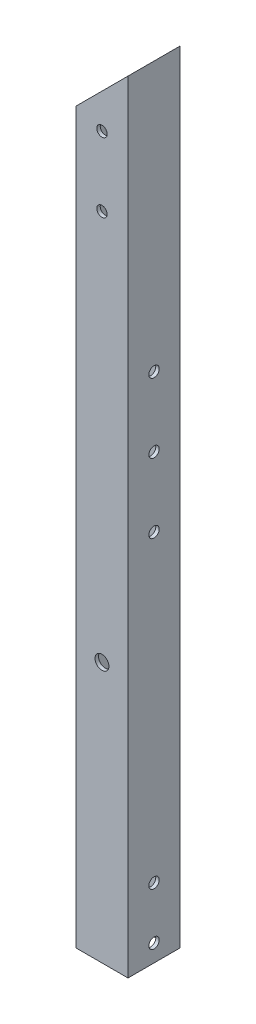
ISO-10303-21;
HEADER;
FILE_DESCRIPTION(('STEP AP214'),'2;1');
FILE_NAME('part.step','',(''),(''),'','','');
FILE_SCHEMA(('AUTOMOTIVE_DESIGN { 1 0 10303 214 1 1 1 1 }'));
ENDSEC;
DATA;
#1=APPLICATION_CONTEXT('core data for automotive mechanical design processes');
#2=APPLICATION_PROTOCOL_DEFINITION('international standard','automotive_design',2000,#1);
#3=PRODUCT_CONTEXT('',#1,'mechanical');
#4=PRODUCT('Part','Part','',(#3));
#5=PRODUCT_RELATED_PRODUCT_CATEGORY('part','',(#4));
#6=PRODUCT_DEFINITION_FORMATION('','',#4);
#7=PRODUCT_DEFINITION_CONTEXT('part definition',#1,'design');
#8=PRODUCT_DEFINITION('design','',#6,#7);
#9=PRODUCT_DEFINITION_SHAPE('','',#8);
#10=(LENGTH_UNIT() NAMED_UNIT(*) SI_UNIT(.MILLI.,.METRE.));
#11=(NAMED_UNIT(*) PLANE_ANGLE_UNIT() SI_UNIT($,.RADIAN.));
#12=(NAMED_UNIT(*) SI_UNIT($,.STERADIAN.) SOLID_ANGLE_UNIT());
#13=UNCERTAINTY_MEASURE_WITH_UNIT(LENGTH_MEASURE(1.E-05),#10,'distance_accuracy_value','');
#14=(GEOMETRIC_REPRESENTATION_CONTEXT(3) GLOBAL_UNCERTAINTY_ASSIGNED_CONTEXT((#13)) GLOBAL_UNIT_ASSIGNED_CONTEXT((#10,
#11,#12)) REPRESENTATION_CONTEXT('',''));
#15=CARTESIAN_POINT('',(0.,0.,0.));
#16=DIRECTION('',(0.,0.,1.));
#17=DIRECTION('',(1.,0.,0.));
#18=AXIS2_PLACEMENT_3D('',#15,#16,#17);
#19=CARTESIAN_POINT('',(0.,0.,0.));
#20=DIRECTION('',(0.,-1.,0.));
#21=DIRECTION('',(0.,0.,-1.));
#22=AXIS2_PLACEMENT_3D('',#19,#20,#21);
#23=PLANE('',#22);
#24=DIRECTION('',(0.,0.,-1.));
#25=VECTOR('',#24,1.);
#26=CARTESIAN_POINT('',(7.5,0.,7.5));
#27=LINE('',#26,#25);
#28=CARTESIAN_POINT('',(7.5,0.,7.5));
#29=VERTEX_POINT('',#28);
#30=CARTESIAN_POINT('',(7.5,0.,-7.5));
#31=VERTEX_POINT('',#30);
#32=EDGE_CURVE('E119',#29,#31,#27,.T.);
#33=ORIENTED_EDGE('',*,*,#32,.F.);
#34=DIRECTION('',(1.,0.,0.));
#35=VECTOR('',#34,1.);
#36=CARTESIAN_POINT('',(-7.5,0.,7.5));
#37=LINE('',#36,#35);
#38=CARTESIAN_POINT('',(-7.5,0.,7.5));
#39=VERTEX_POINT('',#38);
#40=EDGE_CURVE('E108',#39,#29,#37,.T.);
#41=ORIENTED_EDGE('',*,*,#40,.F.);
#42=DIRECTION('',(0.,0.,1.));
#43=VECTOR('',#42,1.);
#44=CARTESIAN_POINT('',(-7.5,0.,7.5));
#45=LINE('',#44,#43);
#46=CARTESIAN_POINT('',(-7.5,0.,-7.5));
#47=VERTEX_POINT('',#46);
#48=EDGE_CURVE('E228',#47,#39,#45,.T.);
#49=ORIENTED_EDGE('',*,*,#48,.F.);
#50=DIRECTION('',(-1.,0.,0.));
#51=VECTOR('',#50,1.);
#52=CARTESIAN_POINT('',(-7.5,0.,-7.5));
#53=LINE('',#52,#51);
#54=EDGE_CURVE('E226',#31,#47,#53,.T.);
#55=ORIENTED_EDGE('',*,*,#54,.F.);
#56=EDGE_LOOP('',(#33,#41,#49,#55));
#57=FACE_BOUND('',#56,.T.);
#58=DIRECTION('',(-1.,0.,0.));
#59=VECTOR('',#58,1.);
#60=CARTESIAN_POINT('',(-6.5,0.,-6.5));
#61=LINE('',#60,#59);
#62=CARTESIAN_POINT('',(6.5,0.,-6.5));
#63=VERTEX_POINT('',#62);
#64=CARTESIAN_POINT('',(-6.5,0.,-6.5));
#65=VERTEX_POINT('',#64);
#66=EDGE_CURVE('E214',#63,#65,#61,.T.);
#67=ORIENTED_EDGE('',*,*,#66,.T.);
#68=DIRECTION('',(0.,0.,1.));
#69=VECTOR('',#68,1.);
#70=CARTESIAN_POINT('',(-6.5,0.,6.5));
#71=LINE('',#70,#69);
#72=CARTESIAN_POINT('',(-6.5,0.,6.5));
#73=VERTEX_POINT('',#72);
#74=EDGE_CURVE('E205',#65,#73,#71,.T.);
#75=ORIENTED_EDGE('',*,*,#74,.T.);
#76=DIRECTION('',(1.,0.,0.));
#77=VECTOR('',#76,1.);
#78=CARTESIAN_POINT('',(-6.5,0.,6.5));
#79=LINE('',#78,#77);
#80=CARTESIAN_POINT('',(6.5,0.,6.5));
#81=VERTEX_POINT('',#80);
#82=EDGE_CURVE('E208',#73,#81,#79,.T.);
#83=ORIENTED_EDGE('',*,*,#82,.T.);
#84=DIRECTION('',(0.,0.,-1.));
#85=VECTOR('',#84,1.);
#86=CARTESIAN_POINT('',(6.5,0.,6.5));
#87=LINE('',#86,#85);
#88=EDGE_CURVE('E211',#81,#63,#87,.T.);
#89=ORIENTED_EDGE('',*,*,#88,.T.);
#90=EDGE_LOOP('',(#67,#75,#83,#89));
#91=FACE_BOUND('',#90,.T.);
#92=ADVANCED_FACE('F34',(#57,#91),#23,.T.);
#93=CARTESIAN_POINT('',(7.5,225.,7.5));
#94=DIRECTION('',(-1.,0.,0.));
#95=DIRECTION('',(0.,0.,1.));
#96=AXIS2_PLACEMENT_3D('',#93,#94,#95);
#97=PLANE('',#96);
#98=CARTESIAN_POINT('',(7.5,107.5,0.));
#99=DIRECTION('',(1.,0.,0.));
#100=DIRECTION('',(0.,0.,-1.));
#101=AXIS2_PLACEMENT_3D('',#98,#99,#100);
#102=CIRCLE('',#101,1.5);
#103=CARTESIAN_POINT('',(7.5,107.5,-1.50000000000001));
#104=VERTEX_POINT('',#103);
#105=EDGE_CURVE('E322',#104,#104,#102,.T.);
#106=ORIENTED_EDGE('',*,*,#105,.F.);
#107=EDGE_LOOP('',(#106));
#108=FACE_BOUND('',#107,.T.);
#109=CARTESIAN_POINT('',(7.5,147.5,0.));
#110=DIRECTION('',(1.,0.,0.));
#111=DIRECTION('',(0.,0.,-1.));
#112=AXIS2_PLACEMENT_3D('',#109,#110,#111);
#113=CIRCLE('',#112,1.5);
#114=CARTESIAN_POINT('',(7.5,147.5,-1.50000000000001));
#115=VERTEX_POINT('',#114);
#116=EDGE_CURVE('E326',#115,#115,#113,.T.);
#117=ORIENTED_EDGE('',*,*,#116,.F.);
#118=EDGE_LOOP('',(#117));
#119=FACE_BOUND('',#118,.T.);
#120=CARTESIAN_POINT('',(7.5,127.5,0.));
#121=DIRECTION('',(1.,0.,0.));
#122=DIRECTION('',(0.,0.,-1.));
#123=AXIS2_PLACEMENT_3D('',#120,#121,#122);
#124=CIRCLE('',#123,1.5);
#125=CARTESIAN_POINT('',(7.5,127.5,-1.50000000000001));
#126=VERTEX_POINT('',#125);
#127=EDGE_CURVE('E330',#126,#126,#124,.T.);
#128=ORIENTED_EDGE('',*,*,#127,.F.);
#129=EDGE_LOOP('',(#128));
#130=FACE_BOUND('',#129,.T.);
#131=CARTESIAN_POINT('',(7.5,20.,0.));
#132=DIRECTION('',(1.,0.,0.));
#133=DIRECTION('',(0.,0.,-1.));
#134=AXIS2_PLACEMENT_3D('',#131,#132,#133);
#135=CIRCLE('',#134,1.5);
#136=CARTESIAN_POINT('',(7.5,20.,-1.50000000000003));
#137=VERTEX_POINT('',#136);
#138=EDGE_CURVE('E334',#137,#137,#135,.T.);
#139=ORIENTED_EDGE('',*,*,#138,.F.);
#140=EDGE_LOOP('',(#139));
#141=FACE_BOUND('',#140,.T.);
#142=CARTESIAN_POINT('',(7.5,5.,0.));
#143=DIRECTION('',(1.,0.,0.));
#144=DIRECTION('',(0.,0.,-1.));
#145=AXIS2_PLACEMENT_3D('',#142,#143,#144);
#146=CIRCLE('',#145,1.5);
#147=CARTESIAN_POINT('',(7.5,5.,-1.50000000000003));
#148=VERTEX_POINT('',#147);
#149=EDGE_CURVE('E169',#148,#148,#146,.T.);
#150=ORIENTED_EDGE('',*,*,#149,.F.);
#151=EDGE_LOOP('',(#150));
#152=FACE_BOUND('',#151,.T.);
#153=ORIENTED_EDGE('',*,*,#32,.T.);
#154=DIRECTION('',(0.,-1.,0.));
#155=VECTOR('',#154,1.);
#156=CARTESIAN_POINT('',(7.5,225.,-7.5));
#157=LINE('',#156,#155);
#158=CARTESIAN_POINT('',(7.5,225.,-7.5));
#159=VERTEX_POINT('',#158);
#160=EDGE_CURVE('E43',#159,#31,#157,.T.);
#161=ORIENTED_EDGE('',*,*,#160,.F.);
#162=DIRECTION('',(0.,0.,-1.));
#163=VECTOR('',#162,1.);
#164=CARTESIAN_POINT('',(7.5,225.,7.5));
#165=LINE('',#164,#163);
#166=CARTESIAN_POINT('',(7.5,225.,7.5));
#167=VERTEX_POINT('',#166);
#168=EDGE_CURVE('E98',#167,#159,#165,.T.);
#169=ORIENTED_EDGE('',*,*,#168,.F.);
#170=DIRECTION('',(0.,-1.,0.));
#171=VECTOR('',#170,1.);
#172=CARTESIAN_POINT('',(7.5,225.,7.5));
#173=LINE('',#172,#171);
#174=EDGE_CURVE('E107',#167,#29,#173,.T.);
#175=ORIENTED_EDGE('',*,*,#174,.T.);
#176=EDGE_LOOP('',(#153,#161,#169,#175));
#177=FACE_BOUND('',#176,.T.);
#178=ADVANCED_FACE('F36',(#108,#119,#130,#141,#152,#177),#97,.F.);
#179=CARTESIAN_POINT('',(-7.5,225.,-7.5));
#180=DIRECTION('',(0.,0.,1.));
#181=DIRECTION('',(1.,0.,0.));
#182=AXIS2_PLACEMENT_3D('',#179,#180,#181);
#183=PLANE('',#182);
#184=CARTESIAN_POINT('',(0.,75.,-7.5));
#185=DIRECTION('',(0.,0.,1.));
#186=DIRECTION('',(1.,0.,0.));
#187=AXIS2_PLACEMENT_3D('',#184,#185,#186);
#188=CIRCLE('',#187,2.);
#189=CARTESIAN_POINT('',(2.,75.,-7.5));
#190=VERTEX_POINT('',#189);
#191=EDGE_CURVE('E178',#190,#190,#188,.T.);
#192=ORIENTED_EDGE('',*,*,#191,.T.);
#193=EDGE_LOOP('',(#192));
#194=FACE_BOUND('',#193,.T.);
#195=CARTESIAN_POINT('',(0.,187.5,-7.5));
#196=DIRECTION('',(0.,0.,1.));
#197=DIRECTION('',(1.,0.,0.));
#198=AXIS2_PLACEMENT_3D('',#195,#196,#197);
#199=CIRCLE('',#198,1.5);
#200=CARTESIAN_POINT('',(1.5,187.5,-7.5));
#201=VERTEX_POINT('',#200);
#202=EDGE_CURVE('E133',#201,#201,#199,.T.);
#203=ORIENTED_EDGE('',*,*,#202,.T.);
#204=EDGE_LOOP('',(#203));
#205=FACE_BOUND('',#204,.T.);
#206=CARTESIAN_POINT('',(0.,207.5,-7.5));
#207=DIRECTION('',(0.,0.,1.));
#208=DIRECTION('',(1.,0.,0.));
#209=AXIS2_PLACEMENT_3D('',#206,#207,#208);
#210=CIRCLE('',#209,1.5);
#211=CARTESIAN_POINT('',(1.5,207.5,-7.5));
#212=VERTEX_POINT('',#211);
#213=EDGE_CURVE('E129',#212,#212,#210,.T.);
#214=ORIENTED_EDGE('',*,*,#213,.T.);
#215=EDGE_LOOP('',(#214));
#216=FACE_BOUND('',#215,.T.);
#217=DIRECTION('',(0.,-1.,0.));
#218=VECTOR('',#217,1.);
#219=CARTESIAN_POINT('',(-7.5,225.,-7.5));
#220=LINE('',#219,#218);
#221=CARTESIAN_POINT('',(-7.5,210.,-7.5));
#222=VERTEX_POINT('',#221);
#223=EDGE_CURVE('E116',#222,#47,#220,.T.);
#224=ORIENTED_EDGE('',*,*,#223,.F.);
#225=DIRECTION('',(0.707106781186548,0.707106781186547,0.));
#226=VECTOR('',#225,1.);
#227=CARTESIAN_POINT('',(-7.5,210.,-7.5));
#228=LINE('',#227,#226);
#229=EDGE_CURVE('E101',#222,#159,#228,.T.);
#230=ORIENTED_EDGE('',*,*,#229,.T.);
#231=ORIENTED_EDGE('',*,*,#160,.T.);
#232=ORIENTED_EDGE('',*,*,#54,.T.);
#233=EDGE_LOOP('',(#224,#230,#231,#232));
#234=FACE_BOUND('',#233,.T.);
#235=ADVANCED_FACE('F113',(#194,#205,#216,#234),#183,.F.);
#236=CARTESIAN_POINT('',(-7.5,225.,7.5));
#237=DIRECTION('',(1.,0.,0.));
#238=DIRECTION('',(0.,0.,-1.));
#239=AXIS2_PLACEMENT_3D('',#236,#237,#238);
#240=PLANE('',#239);
#241=CARTESIAN_POINT('',(-7.5,107.5,0.));
#242=DIRECTION('',(1.,0.,0.));
#243=DIRECTION('',(0.,0.,-1.));
#244=AXIS2_PLACEMENT_3D('',#241,#242,#243);
#245=CIRCLE('',#244,1.5);
#246=CARTESIAN_POINT('',(-7.5,107.5,-1.50000000000001));
#247=VERTEX_POINT('',#246);
#248=EDGE_CURVE('E510',#247,#247,#245,.T.);
#249=ORIENTED_EDGE('',*,*,#248,.T.);
#250=EDGE_LOOP('',(#249));
#251=FACE_BOUND('',#250,.T.);
#252=CARTESIAN_POINT('',(-7.5,147.5,0.));
#253=DIRECTION('',(1.,0.,0.));
#254=DIRECTION('',(0.,0.,-1.));
#255=AXIS2_PLACEMENT_3D('',#252,#253,#254);
#256=CIRCLE('',#255,1.5);
#257=CARTESIAN_POINT('',(-7.5,147.5,-1.50000000000001));
#258=VERTEX_POINT('',#257);
#259=EDGE_CURVE('E512',#258,#258,#256,.T.);
#260=ORIENTED_EDGE('',*,*,#259,.T.);
#261=EDGE_LOOP('',(#260));
#262=FACE_BOUND('',#261,.T.);
#263=CARTESIAN_POINT('',(-7.5,127.5,0.));
#264=DIRECTION('',(1.,0.,0.));
#265=DIRECTION('',(0.,0.,-1.));
#266=AXIS2_PLACEMENT_3D('',#263,#264,#265);
#267=CIRCLE('',#266,1.5);
#268=CARTESIAN_POINT('',(-7.5,127.5,-1.50000000000001));
#269=VERTEX_POINT('',#268);
#270=EDGE_CURVE('E520',#269,#269,#267,.T.);
#271=ORIENTED_EDGE('',*,*,#270,.T.);
#272=EDGE_LOOP('',(#271));
#273=FACE_BOUND('',#272,.T.);
#274=CARTESIAN_POINT('',(-7.5,20.,0.));
#275=DIRECTION('',(1.,0.,0.));
#276=DIRECTION('',(0.,0.,-1.));
#277=AXIS2_PLACEMENT_3D('',#274,#275,#276);
#278=CIRCLE('',#277,1.5);
#279=CARTESIAN_POINT('',(-7.5,20.,-1.50000000000003));
#280=VERTEX_POINT('',#279);
#281=EDGE_CURVE('E148',#280,#280,#278,.T.);
#282=ORIENTED_EDGE('',*,*,#281,.T.);
#283=EDGE_LOOP('',(#282));
#284=FACE_BOUND('',#283,.T.);
#285=CARTESIAN_POINT('',(-7.5,5.,0.));
#286=DIRECTION('',(1.,0.,0.));
#287=DIRECTION('',(0.,0.,-1.));
#288=AXIS2_PLACEMENT_3D('',#285,#286,#287);
#289=CIRCLE('',#288,1.5);
#290=CARTESIAN_POINT('',(-7.5,5.,-1.50000000000003));
#291=VERTEX_POINT('',#290);
#292=EDGE_CURVE('E143',#291,#291,#289,.T.);
#293=ORIENTED_EDGE('',*,*,#292,.T.);
#294=EDGE_LOOP('',(#293));
#295=FACE_BOUND('',#294,.T.);
#296=DIRECTION('',(0.,-1.,0.));
#297=VECTOR('',#296,1.);
#298=CARTESIAN_POINT('',(-7.5,225.,7.5));
#299=LINE('',#298,#297);
#300=CARTESIAN_POINT('',(-7.5,210.,7.5));
#301=VERTEX_POINT('',#300);
#302=EDGE_CURVE('E121',#301,#39,#299,.T.);
#303=ORIENTED_EDGE('',*,*,#302,.F.);
#304=DIRECTION('',(0.,0.,1.));
#305=VECTOR('',#304,1.);
#306=CARTESIAN_POINT('',(-7.5,210.,-7.5));
#307=LINE('',#306,#305);
#308=EDGE_CURVE('E51',#222,#301,#307,.T.);
#309=ORIENTED_EDGE('',*,*,#308,.F.);
#310=ORIENTED_EDGE('',*,*,#223,.T.);
#311=ORIENTED_EDGE('',*,*,#48,.T.);
#312=EDGE_LOOP('',(#303,#309,#310,#311));
#313=FACE_BOUND('',#312,.T.);
#314=ADVANCED_FACE('F238',(#251,#262,#273,#284,#295,#313),#240,.F.);
#315=CARTESIAN_POINT('',(-7.5,225.,7.5));
#316=DIRECTION('',(0.,0.,-1.));
#317=DIRECTION('',(-1.,0.,0.));
#318=AXIS2_PLACEMENT_3D('',#315,#316,#317);
#319=PLANE('',#318);
#320=CARTESIAN_POINT('',(0.,75.,7.5));
#321=DIRECTION('',(0.,0.,1.));
#322=DIRECTION('',(1.,0.,0.));
#323=AXIS2_PLACEMENT_3D('',#320,#321,#322);
#324=CIRCLE('',#323,2.);
#325=CARTESIAN_POINT('',(2.,75.,7.5));
#326=VERTEX_POINT('',#325);
#327=EDGE_CURVE('E175',#326,#326,#324,.T.);
#328=ORIENTED_EDGE('',*,*,#327,.F.);
#329=EDGE_LOOP('',(#328));
#330=FACE_BOUND('',#329,.T.);
#331=CARTESIAN_POINT('',(0.,187.5,7.5));
#332=DIRECTION('',(0.,0.,1.));
#333=DIRECTION('',(1.,0.,0.));
#334=AXIS2_PLACEMENT_3D('',#331,#332,#333);
#335=CIRCLE('',#334,1.5);
#336=CARTESIAN_POINT('',(1.5,187.5,7.5));
#337=VERTEX_POINT('',#336);
#338=EDGE_CURVE('E180',#337,#337,#335,.T.);
#339=ORIENTED_EDGE('',*,*,#338,.F.);
#340=EDGE_LOOP('',(#339));
#341=FACE_BOUND('',#340,.T.);
#342=CARTESIAN_POINT('',(0.,207.5,7.5));
#343=DIRECTION('',(0.,0.,1.));
#344=DIRECTION('',(1.,0.,0.));
#345=AXIS2_PLACEMENT_3D('',#342,#343,#344);
#346=CIRCLE('',#345,1.5);
#347=CARTESIAN_POINT('',(1.5,207.5,7.5));
#348=VERTEX_POINT('',#347);
#349=EDGE_CURVE('E198',#348,#348,#346,.T.);
#350=ORIENTED_EDGE('',*,*,#349,.F.);
#351=EDGE_LOOP('',(#350));
#352=FACE_BOUND('',#351,.T.);
#353=ORIENTED_EDGE('',*,*,#174,.F.);
#354=DIRECTION('',(0.707106781186548,0.707106781186547,0.));
#355=VECTOR('',#354,1.);
#356=CARTESIAN_POINT('',(-7.5,210.,7.5));
#357=LINE('',#356,#355);
#358=EDGE_CURVE('E102',#301,#167,#357,.T.);
#359=ORIENTED_EDGE('',*,*,#358,.F.);
#360=ORIENTED_EDGE('',*,*,#302,.T.);
#361=ORIENTED_EDGE('',*,*,#40,.T.);
#362=EDGE_LOOP('',(#353,#359,#360,#361));
#363=FACE_BOUND('',#362,.T.);
#364=ADVANCED_FACE('F234',(#330,#341,#352,#363),#319,.F.);
#365=CARTESIAN_POINT('',(-6.5,225.,6.5));
#366=DIRECTION('',(1.,0.,0.));
#367=DIRECTION('',(0.,0.,-1.));
#368=AXIS2_PLACEMENT_3D('',#365,#366,#367);
#369=PLANE('',#368);
#370=CARTESIAN_POINT('',(-6.5,107.5,0.));
#371=DIRECTION('',(1.,0.,0.));
#372=DIRECTION('',(0.,0.,-1.));
#373=AXIS2_PLACEMENT_3D('',#370,#371,#372);
#374=CIRCLE('',#373,1.5);
#375=CARTESIAN_POINT('',(-6.5,107.5,-1.50000000000001));
#376=VERTEX_POINT('',#375);
#377=EDGE_CURVE('E166',#376,#376,#374,.T.);
#378=ORIENTED_EDGE('',*,*,#377,.F.);
#379=EDGE_LOOP('',(#378));
#380=FACE_BOUND('',#379,.T.);
#381=CARTESIAN_POINT('',(-6.5,147.5,0.));
#382=DIRECTION('',(1.,0.,0.));
#383=DIRECTION('',(0.,0.,-1.));
#384=AXIS2_PLACEMENT_3D('',#381,#382,#383);
#385=CIRCLE('',#384,1.5);
#386=CARTESIAN_POINT('',(-6.5,147.5,-1.50000000000001));
#387=VERTEX_POINT('',#386);
#388=EDGE_CURVE('E154',#387,#387,#385,.T.);
#389=ORIENTED_EDGE('',*,*,#388,.F.);
#390=EDGE_LOOP('',(#389));
#391=FACE_BOUND('',#390,.T.);
#392=CARTESIAN_POINT('',(-6.5,127.5,0.));
#393=DIRECTION('',(1.,0.,0.));
#394=DIRECTION('',(0.,0.,-1.));
#395=AXIS2_PLACEMENT_3D('',#392,#393,#394);
#396=CIRCLE('',#395,1.5);
#397=CARTESIAN_POINT('',(-6.5,127.5,-1.50000000000001));
#398=VERTEX_POINT('',#397);
#399=EDGE_CURVE('E151',#398,#398,#396,.T.);
#400=ORIENTED_EDGE('',*,*,#399,.F.);
#401=EDGE_LOOP('',(#400));
#402=FACE_BOUND('',#401,.T.);
#403=CARTESIAN_POINT('',(-6.5,20.,0.));
#404=DIRECTION('',(1.,0.,0.));
#405=DIRECTION('',(0.,0.,-1.));
#406=AXIS2_PLACEMENT_3D('',#403,#404,#405);
#407=CIRCLE('',#406,1.5);
#408=CARTESIAN_POINT('',(-6.5,20.,-1.50000000000003));
#409=VERTEX_POINT('',#408);
#410=EDGE_CURVE('E147',#409,#409,#407,.T.);
#411=ORIENTED_EDGE('',*,*,#410,.F.);
#412=EDGE_LOOP('',(#411));
#413=FACE_BOUND('',#412,.T.);
#414=CARTESIAN_POINT('',(-6.5,5.,0.));
#415=DIRECTION('',(1.,0.,0.));
#416=DIRECTION('',(0.,0.,-1.));
#417=AXIS2_PLACEMENT_3D('',#414,#415,#416);
#418=CIRCLE('',#417,1.5);
#419=CARTESIAN_POINT('',(-6.5,5.,-1.50000000000003));
#420=VERTEX_POINT('',#419);
#421=EDGE_CURVE('E142',#420,#420,#418,.T.);
#422=ORIENTED_EDGE('',*,*,#421,.F.);
#423=EDGE_LOOP('',(#422));
#424=FACE_BOUND('',#423,.T.);
#425=DIRECTION('',(0.,0.,-1.));
#426=VECTOR('',#425,1.);
#427=CARTESIAN_POINT('',(-6.5,211.,6.5));
#428=LINE('',#427,#426);
#429=CARTESIAN_POINT('',(-6.5,211.,6.5));
#430=VERTEX_POINT('',#429);
#431=CARTESIAN_POINT('',(-6.5,211.,-6.5));
#432=VERTEX_POINT('',#431);
#433=EDGE_CURVE('E58',#430,#432,#428,.T.);
#434=ORIENTED_EDGE('',*,*,#433,.F.);
#435=DIRECTION('',(0.,-1.,0.));
#436=VECTOR('',#435,1.);
#437=CARTESIAN_POINT('',(-6.5,225.,6.5));
#438=LINE('',#437,#436);
#439=EDGE_CURVE('E223',#430,#73,#438,.T.);
#440=ORIENTED_EDGE('',*,*,#439,.T.);
#441=ORIENTED_EDGE('',*,*,#74,.F.);
#442=DIRECTION('',(0.,-1.,0.));
#443=VECTOR('',#442,1.);
#444=CARTESIAN_POINT('',(-6.5,225.,-6.5));
#445=LINE('',#444,#443);
#446=EDGE_CURVE('E217',#432,#65,#445,.T.);
#447=ORIENTED_EDGE('',*,*,#446,.F.);
#448=EDGE_LOOP('',(#434,#440,#441,#447));
#449=FACE_BOUND('',#448,.T.);
#450=ADVANCED_FACE('F252',(#380,#391,#402,#413,#424,#449),#369,.T.);
#451=CARTESIAN_POINT('',(-6.5,225.,6.5));
#452=DIRECTION('',(0.,0.,-1.));
#453=DIRECTION('',(-1.,0.,0.));
#454=AXIS2_PLACEMENT_3D('',#451,#452,#453);
#455=PLANE('',#454);
#456=CARTESIAN_POINT('',(0.,75.,6.5));
#457=DIRECTION('',(0.,0.,-1.));
#458=DIRECTION('',(-1.,0.,0.));
#459=AXIS2_PLACEMENT_3D('',#456,#457,#458);
#460=CIRCLE('',#459,2.);
#461=CARTESIAN_POINT('',(-2.,75.,6.5));
#462=VERTEX_POINT('',#461);
#463=EDGE_CURVE('E138',#462,#462,#460,.T.);
#464=ORIENTED_EDGE('',*,*,#463,.F.);
#465=EDGE_LOOP('',(#464));
#466=FACE_BOUND('',#465,.T.);
#467=DIRECTION('',(-0.707106781186548,-0.707106781186547,0.));
#468=VECTOR('',#467,1.);
#469=CARTESIAN_POINT('',(0.499999999999994,218.,6.5));
#470=LINE('',#469,#468);
#471=CARTESIAN_POINT('',(6.5,224.,6.5));
#472=VERTEX_POINT('',#471);
#473=EDGE_CURVE('E193',#472,#430,#470,.T.);
#474=ORIENTED_EDGE('',*,*,#473,.F.);
#475=DIRECTION('',(0.,-1.,0.));
#476=VECTOR('',#475,1.);
#477=CARTESIAN_POINT('',(6.5,225.,6.5));
#478=LINE('',#477,#476);
#479=EDGE_CURVE('E221',#472,#81,#478,.T.);
#480=ORIENTED_EDGE('',*,*,#479,.T.);
#481=ORIENTED_EDGE('',*,*,#82,.F.);
#482=ORIENTED_EDGE('',*,*,#439,.F.);
#483=EDGE_LOOP('',(#474,#480,#481,#482));
#484=FACE_BOUND('',#483,.T.);
#485=CARTESIAN_POINT('',(0.,187.5,6.5));
#486=DIRECTION('',(0.,0.,-1.));
#487=DIRECTION('',(-1.,0.,0.));
#488=AXIS2_PLACEMENT_3D('',#485,#486,#487);
#489=CIRCLE('',#488,1.5);
#490=CARTESIAN_POINT('',(-1.5,187.5,6.5));
#491=VERTEX_POINT('',#490);
#492=EDGE_CURVE('E132',#491,#491,#489,.T.);
#493=ORIENTED_EDGE('',*,*,#492,.F.);
#494=EDGE_LOOP('',(#493));
#495=FACE_BOUND('',#494,.T.);
#496=CARTESIAN_POINT('',(0.,207.5,6.5));
#497=DIRECTION('',(0.,0.,-1.));
#498=DIRECTION('',(-1.,0.,0.));
#499=AXIS2_PLACEMENT_3D('',#496,#497,#498);
#500=CIRCLE('',#499,1.5);
#501=CARTESIAN_POINT('',(-1.5,207.5,6.5));
#502=VERTEX_POINT('',#501);
#503=EDGE_CURVE('E128',#502,#502,#500,.T.);
#504=ORIENTED_EDGE('',*,*,#503,.F.);
#505=EDGE_LOOP('',(#504));
#506=FACE_BOUND('',#505,.T.);
#507=ADVANCED_FACE('F257',(#466,#484,#495,#506),#455,.T.);
#508=CARTESIAN_POINT('',(6.5,225.,6.5));
#509=DIRECTION('',(-1.,0.,0.));
#510=DIRECTION('',(0.,0.,1.));
#511=AXIS2_PLACEMENT_3D('',#508,#509,#510);
#512=PLANE('',#511);
#513=CARTESIAN_POINT('',(6.5,107.5,0.));
#514=DIRECTION('',(-1.,0.,0.));
#515=DIRECTION('',(0.,0.,1.));
#516=AXIS2_PLACEMENT_3D('',#513,#514,#515);
#517=CIRCLE('',#516,1.5);
#518=CARTESIAN_POINT('',(6.5,107.5,1.49999999999999));
#519=VERTEX_POINT('',#518);
#520=EDGE_CURVE('E38',#519,#519,#517,.T.);
#521=ORIENTED_EDGE('',*,*,#520,.F.);
#522=EDGE_LOOP('',(#521));
#523=FACE_BOUND('',#522,.T.);
#524=CARTESIAN_POINT('',(6.5,147.5,0.));
#525=DIRECTION('',(-1.,0.,0.));
#526=DIRECTION('',(0.,0.,1.));
#527=AXIS2_PLACEMENT_3D('',#524,#525,#526);
#528=CIRCLE('',#527,1.5);
#529=CARTESIAN_POINT('',(6.5,147.5,1.49999999999999));
#530=VERTEX_POINT('',#529);
#531=EDGE_CURVE('E152',#530,#530,#528,.T.);
#532=ORIENTED_EDGE('',*,*,#531,.F.);
#533=EDGE_LOOP('',(#532));
#534=FACE_BOUND('',#533,.T.);
#535=CARTESIAN_POINT('',(6.5,127.5,0.));
#536=DIRECTION('',(-1.,0.,0.));
#537=DIRECTION('',(0.,0.,1.));
#538=AXIS2_PLACEMENT_3D('',#535,#536,#537);
#539=CIRCLE('',#538,1.5);
#540=CARTESIAN_POINT('',(6.5,127.5,1.49999999999999));
#541=VERTEX_POINT('',#540);
#542=EDGE_CURVE('E149',#541,#541,#539,.T.);
#543=ORIENTED_EDGE('',*,*,#542,.F.);
#544=EDGE_LOOP('',(#543));
#545=FACE_BOUND('',#544,.T.);
#546=CARTESIAN_POINT('',(6.5,20.,0.));
#547=DIRECTION('',(-1.,0.,0.));
#548=DIRECTION('',(0.,0.,1.));
#549=AXIS2_PLACEMENT_3D('',#546,#547,#548);
#550=CIRCLE('',#549,1.5);
#551=CARTESIAN_POINT('',(6.5,20.,1.49999999999998));
#552=VERTEX_POINT('',#551);
#553=EDGE_CURVE('E144',#552,#552,#550,.T.);
#554=ORIENTED_EDGE('',*,*,#553,.F.);
#555=EDGE_LOOP('',(#554));
#556=FACE_BOUND('',#555,.T.);
#557=CARTESIAN_POINT('',(6.5,5.,0.));
#558=DIRECTION('',(-1.,0.,0.));
#559=DIRECTION('',(0.,0.,1.));
#560=AXIS2_PLACEMENT_3D('',#557,#558,#559);
#561=CIRCLE('',#560,1.5);
#562=CARTESIAN_POINT('',(6.5,5.,1.49999999999997));
#563=VERTEX_POINT('',#562);
#564=EDGE_CURVE('E139',#563,#563,#561,.T.);
#565=ORIENTED_EDGE('',*,*,#564,.F.);
#566=EDGE_LOOP('',(#565));
#567=FACE_BOUND('',#566,.T.);
#568=DIRECTION('',(0.,0.,1.));
#569=VECTOR('',#568,1.);
#570=CARTESIAN_POINT('',(6.5,224.,6.5));
#571=LINE('',#570,#569);
#572=CARTESIAN_POINT('',(6.5,224.,-6.5));
#573=VERTEX_POINT('',#572);
#574=EDGE_CURVE('E191',#573,#472,#571,.T.);
#575=ORIENTED_EDGE('',*,*,#574,.F.);
#576=DIRECTION('',(0.,-1.,0.));
#577=VECTOR('',#576,1.);
#578=CARTESIAN_POINT('',(6.5,225.,-6.5));
#579=LINE('',#578,#577);
#580=EDGE_CURVE('E219',#573,#63,#579,.T.);
#581=ORIENTED_EDGE('',*,*,#580,.T.);
#582=ORIENTED_EDGE('',*,*,#88,.F.);
#583=ORIENTED_EDGE('',*,*,#479,.F.);
#584=EDGE_LOOP('',(#575,#581,#582,#583));
#585=FACE_BOUND('',#584,.T.);
#586=ADVANCED_FACE('F262',(#523,#534,#545,#556,#567,#585),#512,.T.);
#587=CARTESIAN_POINT('',(-6.5,225.,-6.5));
#588=DIRECTION('',(0.,0.,1.));
#589=DIRECTION('',(1.,0.,0.));
#590=AXIS2_PLACEMENT_3D('',#587,#588,#589);
#591=PLANE('',#590);
#592=CARTESIAN_POINT('',(0.,75.,-6.5));
#593=DIRECTION('',(0.,0.,1.));
#594=DIRECTION('',(1.,0.,0.));
#595=AXIS2_PLACEMENT_3D('',#592,#593,#594);
#596=CIRCLE('',#595,2.);
#597=CARTESIAN_POINT('',(2.,75.,-6.5));
#598=VERTEX_POINT('',#597);
#599=EDGE_CURVE('E135',#598,#598,#596,.T.);
#600=ORIENTED_EDGE('',*,*,#599,.F.);
#601=EDGE_LOOP('',(#600));
#602=FACE_BOUND('',#601,.T.);
#603=DIRECTION('',(0.707106781186548,0.707106781186547,0.));
#604=VECTOR('',#603,1.);
#605=CARTESIAN_POINT('',(0.499999999999994,218.,-6.5));
#606=LINE('',#605,#604);
#607=EDGE_CURVE('E11',#432,#573,#606,.T.);
#608=ORIENTED_EDGE('',*,*,#607,.F.);
#609=ORIENTED_EDGE('',*,*,#446,.T.);
#610=ORIENTED_EDGE('',*,*,#66,.F.);
#611=ORIENTED_EDGE('',*,*,#580,.F.);
#612=EDGE_LOOP('',(#608,#609,#610,#611));
#613=FACE_BOUND('',#612,.T.);
#614=CARTESIAN_POINT('',(0.,187.5,-6.5));
#615=DIRECTION('',(0.,0.,1.));
#616=DIRECTION('',(1.,0.,0.));
#617=AXIS2_PLACEMENT_3D('',#614,#615,#616);
#618=CIRCLE('',#617,1.5);
#619=CARTESIAN_POINT('',(1.5,187.5,-6.5));
#620=VERTEX_POINT('',#619);
#621=EDGE_CURVE('E130',#620,#620,#618,.T.);
#622=ORIENTED_EDGE('',*,*,#621,.F.);
#623=EDGE_LOOP('',(#622));
#624=FACE_BOUND('',#623,.T.);
#625=CARTESIAN_POINT('',(0.,207.5,-6.5));
#626=DIRECTION('',(0.,0.,1.));
#627=DIRECTION('',(1.,0.,0.));
#628=AXIS2_PLACEMENT_3D('',#625,#626,#627);
#629=CIRCLE('',#628,1.5);
#630=CARTESIAN_POINT('',(1.5,207.5,-6.5));
#631=VERTEX_POINT('',#630);
#632=EDGE_CURVE('E125',#631,#631,#629,.T.);
#633=ORIENTED_EDGE('',*,*,#632,.F.);
#634=EDGE_LOOP('',(#633));
#635=FACE_BOUND('',#634,.T.);
#636=ADVANCED_FACE('F248',(#602,#613,#624,#635),#591,.T.);
#637=CARTESIAN_POINT('',(0.,207.5,-7.5));
#638=DIRECTION('',(0.,0.,1.));
#639=DIRECTION('',(1.,0.,0.));
#640=AXIS2_PLACEMENT_3D('',#637,#638,#639);
#641=CYLINDRICAL_SURFACE('',#640,1.5);
#642=ORIENTED_EDGE('',*,*,#632,.T.);
#643=EDGE_LOOP('',(#642));
#644=FACE_BOUND('',#643,.T.);
#645=ORIENTED_EDGE('',*,*,#213,.F.);
#646=EDGE_LOOP('',(#645));
#647=FACE_BOUND('',#646,.T.);
#648=ADVANCED_FACE('F282',(#644,#647),#641,.F.);
#649=ORIENTED_EDGE('',*,*,#503,.T.);
#650=EDGE_LOOP('',(#649));
#651=FACE_BOUND('',#650,.T.);
#652=ORIENTED_EDGE('',*,*,#349,.T.);
#653=EDGE_LOOP('',(#652));
#654=FACE_BOUND('',#653,.T.);
#655=ADVANCED_FACE('F275',(#651,#654),#641,.F.);
#656=CARTESIAN_POINT('',(0.,187.5,-7.5));
#657=DIRECTION('',(0.,0.,1.));
#658=DIRECTION('',(1.,0.,0.));
#659=AXIS2_PLACEMENT_3D('',#656,#657,#658);
#660=CYLINDRICAL_SURFACE('',#659,1.5);
#661=ORIENTED_EDGE('',*,*,#621,.T.);
#662=EDGE_LOOP('',(#661));
#663=FACE_BOUND('',#662,.T.);
#664=ORIENTED_EDGE('',*,*,#202,.F.);
#665=EDGE_LOOP('',(#664));
#666=FACE_BOUND('',#665,.T.);
#667=ADVANCED_FACE('F265',(#663,#666),#660,.F.);
#668=CARTESIAN_POINT('',(-7.5,210.,-7.5));
#669=DIRECTION('',(0.707106781186547,-0.707106781186548,0.));
#670=DIRECTION('',(0.707106781186548,0.707106781186547,0.));
#671=AXIS2_PLACEMENT_3D('',#668,#669,#670);
#672=PLANE('',#671);
#673=ORIENTED_EDGE('',*,*,#433,.T.);
#674=ORIENTED_EDGE('',*,*,#607,.T.);
#675=ORIENTED_EDGE('',*,*,#574,.T.);
#676=ORIENTED_EDGE('',*,*,#473,.T.);
#677=EDGE_LOOP('',(#673,#674,#675,#676));
#678=FACE_BOUND('',#677,.T.);
#679=ORIENTED_EDGE('',*,*,#358,.T.);
#680=ORIENTED_EDGE('',*,*,#168,.T.);
#681=ORIENTED_EDGE('',*,*,#229,.F.);
#682=ORIENTED_EDGE('',*,*,#308,.T.);
#683=EDGE_LOOP('',(#679,#680,#681,#682));
#684=FACE_BOUND('',#683,.T.);
#685=ADVANCED_FACE('F100',(#678,#684),#672,.F.);
#686=CARTESIAN_POINT('',(0.,75.,-7.5));
#687=DIRECTION('',(0.,0.,1.));
#688=DIRECTION('',(1.,0.,0.));
#689=AXIS2_PLACEMENT_3D('',#686,#687,#688);
#690=CYLINDRICAL_SURFACE('',#689,2.);
#691=ORIENTED_EDGE('',*,*,#599,.T.);
#692=EDGE_LOOP('',(#691));
#693=FACE_BOUND('',#692,.T.);
#694=ORIENTED_EDGE('',*,*,#191,.F.);
#695=EDGE_LOOP('',(#694));
#696=FACE_BOUND('',#695,.T.);
#697=ADVANCED_FACE('F264',(#693,#696),#690,.F.);
#698=ORIENTED_EDGE('',*,*,#492,.T.);
#699=EDGE_LOOP('',(#698));
#700=FACE_BOUND('',#699,.T.);
#701=ORIENTED_EDGE('',*,*,#338,.T.);
#702=EDGE_LOOP('',(#701));
#703=FACE_BOUND('',#702,.T.);
#704=ADVANCED_FACE('F271',(#700,#703),#660,.F.);
#705=ORIENTED_EDGE('',*,*,#463,.T.);
#706=EDGE_LOOP('',(#705));
#707=FACE_BOUND('',#706,.T.);
#708=ORIENTED_EDGE('',*,*,#327,.T.);
#709=EDGE_LOOP('',(#708));
#710=FACE_BOUND('',#709,.T.);
#711=ADVANCED_FACE('F274',(#707,#710),#690,.F.);
#712=CARTESIAN_POINT('',(-7.5,5.,0.));
#713=DIRECTION('',(1.,0.,0.));
#714=DIRECTION('',(0.,0.,-1.));
#715=AXIS2_PLACEMENT_3D('',#712,#713,#714);
#716=CYLINDRICAL_SURFACE('',#715,1.5);
#717=ORIENTED_EDGE('',*,*,#564,.T.);
#718=EDGE_LOOP('',(#717));
#719=FACE_BOUND('',#718,.T.);
#720=ORIENTED_EDGE('',*,*,#149,.T.);
#721=EDGE_LOOP('',(#720));
#722=FACE_BOUND('',#721,.T.);
#723=ADVANCED_FACE('F279',(#719,#722),#716,.F.);
#724=ORIENTED_EDGE('',*,*,#421,.T.);
#725=EDGE_LOOP('',(#724));
#726=FACE_BOUND('',#725,.T.);
#727=ORIENTED_EDGE('',*,*,#292,.F.);
#728=EDGE_LOOP('',(#727));
#729=FACE_BOUND('',#728,.T.);
#730=ADVANCED_FACE('F338',(#726,#729),#716,.F.);
#731=CARTESIAN_POINT('',(-7.5,20.,0.));
#732=DIRECTION('',(1.,0.,0.));
#733=DIRECTION('',(0.,0.,-1.));
#734=AXIS2_PLACEMENT_3D('',#731,#732,#733);
#735=CYLINDRICAL_SURFACE('',#734,1.5);
#736=ORIENTED_EDGE('',*,*,#553,.T.);
#737=EDGE_LOOP('',(#736));
#738=FACE_BOUND('',#737,.T.);
#739=ORIENTED_EDGE('',*,*,#138,.T.);
#740=EDGE_LOOP('',(#739));
#741=FACE_BOUND('',#740,.T.);
#742=ADVANCED_FACE('F344',(#738,#741),#735,.F.);
#743=CARTESIAN_POINT('',(-7.5,127.5,0.));
#744=DIRECTION('',(1.,0.,0.));
#745=DIRECTION('',(0.,0.,-1.));
#746=AXIS2_PLACEMENT_3D('',#743,#744,#745);
#747=CYLINDRICAL_SURFACE('',#746,1.5);
#748=ORIENTED_EDGE('',*,*,#542,.T.);
#749=EDGE_LOOP('',(#748));
#750=FACE_BOUND('',#749,.T.);
#751=ORIENTED_EDGE('',*,*,#127,.T.);
#752=EDGE_LOOP('',(#751));
#753=FACE_BOUND('',#752,.T.);
#754=ADVANCED_FACE('F439',(#750,#753),#747,.F.);
#755=CARTESIAN_POINT('',(-7.5,147.5,0.));
#756=DIRECTION('',(1.,0.,0.));
#757=DIRECTION('',(0.,0.,-1.));
#758=AXIS2_PLACEMENT_3D('',#755,#756,#757);
#759=CYLINDRICAL_SURFACE('',#758,1.5);
#760=ORIENTED_EDGE('',*,*,#531,.T.);
#761=EDGE_LOOP('',(#760));
#762=FACE_BOUND('',#761,.T.);
#763=ORIENTED_EDGE('',*,*,#116,.T.);
#764=EDGE_LOOP('',(#763));
#765=FACE_BOUND('',#764,.T.);
#766=ADVANCED_FACE('F450',(#762,#765),#759,.F.);
#767=CARTESIAN_POINT('',(-7.5,107.5,0.));
#768=DIRECTION('',(1.,0.,0.));
#769=DIRECTION('',(0.,0.,-1.));
#770=AXIS2_PLACEMENT_3D('',#767,#768,#769);
#771=CYLINDRICAL_SURFACE('',#770,1.5);
#772=ORIENTED_EDGE('',*,*,#520,.T.);
#773=EDGE_LOOP('',(#772));
#774=FACE_BOUND('',#773,.T.);
#775=ORIENTED_EDGE('',*,*,#105,.T.);
#776=EDGE_LOOP('',(#775));
#777=FACE_BOUND('',#776,.T.);
#778=ADVANCED_FACE('F460',(#774,#777),#771,.F.);
#779=ORIENTED_EDGE('',*,*,#410,.T.);
#780=EDGE_LOOP('',(#779));
#781=FACE_BOUND('',#780,.T.);
#782=ORIENTED_EDGE('',*,*,#281,.F.);
#783=EDGE_LOOP('',(#782));
#784=FACE_BOUND('',#783,.T.);
#785=ADVANCED_FACE('F442',(#781,#784),#735,.F.);
#786=ORIENTED_EDGE('',*,*,#399,.T.);
#787=EDGE_LOOP('',(#786));
#788=FACE_BOUND('',#787,.T.);
#789=ORIENTED_EDGE('',*,*,#270,.F.);
#790=EDGE_LOOP('',(#789));
#791=FACE_BOUND('',#790,.T.);
#792=ADVANCED_FACE('F452',(#788,#791),#747,.F.);
#793=ORIENTED_EDGE('',*,*,#388,.T.);
#794=EDGE_LOOP('',(#793));
#795=FACE_BOUND('',#794,.T.);
#796=ORIENTED_EDGE('',*,*,#259,.F.);
#797=EDGE_LOOP('',(#796));
#798=FACE_BOUND('',#797,.T.);
#799=ADVANCED_FACE('F462',(#795,#798),#759,.F.);
#800=ORIENTED_EDGE('',*,*,#377,.T.);
#801=EDGE_LOOP('',(#800));
#802=FACE_BOUND('',#801,.T.);
#803=ORIENTED_EDGE('',*,*,#248,.F.);
#804=EDGE_LOOP('',(#803));
#805=FACE_BOUND('',#804,.T.);
#806=ADVANCED_FACE('F472',(#802,#805),#771,.F.);
#807=CLOSED_SHELL('',(#92,#178,#235,#314,#364,#450,#507,#586,#636,#648,#655,#667,#685,#697,#704,
#711,#723,#730,#742,#754,#766,#778,#785,#792,#799,#806));
#808=MANIFOLD_SOLID_BREP('B2',#807);
#809=ADVANCED_BREP_SHAPE_REPRESENTATION('',(#18,#808),#14);
#810=SHAPE_DEFINITION_REPRESENTATION(#9,#809);
ENDSEC;
END-ISO-10303-21;
